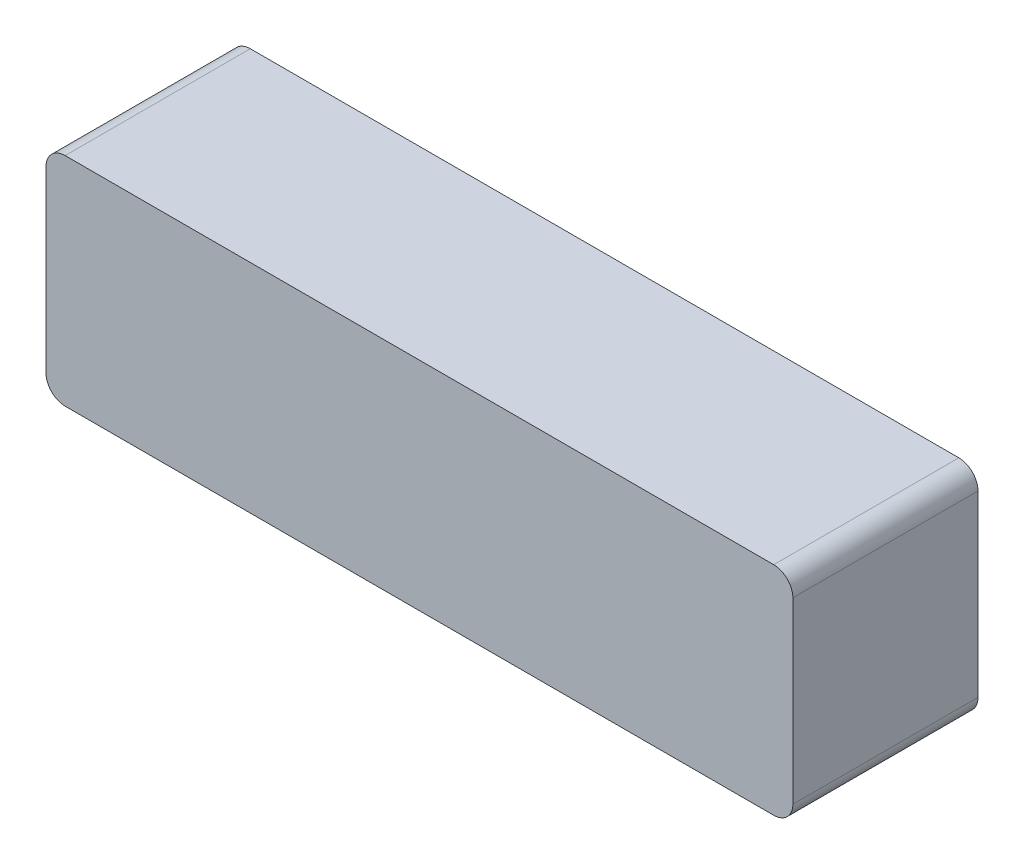
ISO-10303-21;
HEADER;
FILE_DESCRIPTION(('STEP AP214'),'2;1');
FILE_NAME('part.step','',(''),(''),'','','');
FILE_SCHEMA(('AUTOMOTIVE_DESIGN { 1 0 10303 214 1 1 1 1 }'));
ENDSEC;
DATA;
#1=APPLICATION_CONTEXT('core data for automotive mechanical design processes');
#2=APPLICATION_PROTOCOL_DEFINITION('international standard','automotive_design',2000,#1);
#3=PRODUCT_CONTEXT('',#1,'mechanical');
#4=PRODUCT('Part','Part','',(#3));
#5=PRODUCT_RELATED_PRODUCT_CATEGORY('part','',(#4));
#6=PRODUCT_DEFINITION_FORMATION('','',#4);
#7=PRODUCT_DEFINITION_CONTEXT('part definition',#1,'design');
#8=PRODUCT_DEFINITION('design','',#6,#7);
#9=PRODUCT_DEFINITION_SHAPE('','',#8);
#10=(LENGTH_UNIT() NAMED_UNIT(*) SI_UNIT(.MILLI.,.METRE.));
#11=(NAMED_UNIT(*) PLANE_ANGLE_UNIT() SI_UNIT($,.RADIAN.));
#12=(NAMED_UNIT(*) SI_UNIT($,.STERADIAN.) SOLID_ANGLE_UNIT());
#13=UNCERTAINTY_MEASURE_WITH_UNIT(LENGTH_MEASURE(1.E-05),#10,'distance_accuracy_value','');
#14=(GEOMETRIC_REPRESENTATION_CONTEXT(3) GLOBAL_UNCERTAINTY_ASSIGNED_CONTEXT((#13)) GLOBAL_UNIT_ASSIGNED_CONTEXT((#10,
#11,#12)) REPRESENTATION_CONTEXT('',''));
#15=CARTESIAN_POINT('',(0.,0.,0.));
#16=DIRECTION('',(0.,0.,1.));
#17=DIRECTION('',(1.,0.,0.));
#18=AXIS2_PLACEMENT_3D('',#15,#16,#17);
#19=CARTESIAN_POINT('',(55.5,14.,29.));
#20=DIRECTION('',(0.,0.,-1.));
#21=DIRECTION('',(-1.,0.,0.));
#22=AXIS2_PLACEMENT_3D('',#19,#20,#21);
#23=CYLINDRICAL_SURFACE('',#22,3.);
#24=CARTESIAN_POINT('',(55.5,14.,0.));
#25=DIRECTION('',(0.,0.,1.));
#26=DIRECTION('',(-1.,0.,0.));
#27=AXIS2_PLACEMENT_3D('',#24,#25,#26);
#28=CIRCLE('',#27,3.);
#29=CARTESIAN_POINT('',(58.5,14.,0.));
#30=VERTEX_POINT('',#29);
#31=CARTESIAN_POINT('',(55.5,17.,0.));
#32=VERTEX_POINT('',#31);
#33=EDGE_CURVE('E140',#30,#32,#28,.T.);
#34=ORIENTED_EDGE('',*,*,#33,.T.);
#35=DIRECTION('',(0.,0.,-1.));
#36=VECTOR('',#35,1.);
#37=CARTESIAN_POINT('',(55.5,17.,29.));
#38=LINE('',#37,#36);
#39=CARTESIAN_POINT('',(55.5,17.,29.));
#40=VERTEX_POINT('',#39);
#41=EDGE_CURVE('E11',#40,#32,#38,.T.);
#42=ORIENTED_EDGE('',*,*,#41,.F.);
#43=CARTESIAN_POINT('',(55.5,14.,29.));
#44=DIRECTION('',(0.,0.,1.));
#45=DIRECTION('',(-1.,0.,0.));
#46=AXIS2_PLACEMENT_3D('',#43,#44,#45);
#47=CIRCLE('',#46,3.);
#48=CARTESIAN_POINT('',(58.5,14.,29.));
#49=VERTEX_POINT('',#48);
#50=EDGE_CURVE('E162',#49,#40,#47,.T.);
#51=ORIENTED_EDGE('',*,*,#50,.F.);
#52=DIRECTION('',(0.,0.,-1.));
#53=VECTOR('',#52,1.);
#54=CARTESIAN_POINT('',(58.5,14.,29.));
#55=LINE('',#54,#53);
#56=EDGE_CURVE('E136',#49,#30,#55,.T.);
#57=ORIENTED_EDGE('',*,*,#56,.T.);
#58=EDGE_LOOP('',(#34,#42,#51,#57));
#59=FACE_BOUND('',#58,.T.);
#60=ADVANCED_FACE('F39',(#59),#23,.T.);
#61=CARTESIAN_POINT('',(-55.5,17.,29.));
#62=DIRECTION('',(0.,-1.,0.));
#63=DIRECTION('',(0.,0.,-1.));
#64=AXIS2_PLACEMENT_3D('',#61,#62,#63);
#65=PLANE('',#64);
#66=DIRECTION('',(-1.,0.,0.));
#67=VECTOR('',#66,1.);
#68=CARTESIAN_POINT('',(-55.5,17.,0.));
#69=LINE('',#68,#67);
#70=CARTESIAN_POINT('',(-55.5,17.,0.));
#71=VERTEX_POINT('',#70);
#72=EDGE_CURVE('E144',#32,#71,#69,.T.);
#73=ORIENTED_EDGE('',*,*,#72,.T.);
#74=DIRECTION('',(0.,0.,-1.));
#75=VECTOR('',#74,1.);
#76=CARTESIAN_POINT('',(-55.5,17.,29.));
#77=LINE('',#76,#75);
#78=CARTESIAN_POINT('',(-55.5,17.,29.));
#79=VERTEX_POINT('',#78);
#80=EDGE_CURVE('E48',#79,#71,#77,.T.);
#81=ORIENTED_EDGE('',*,*,#80,.F.);
#82=DIRECTION('',(-1.,0.,0.));
#83=VECTOR('',#82,1.);
#84=CARTESIAN_POINT('',(-55.5,17.,29.));
#85=LINE('',#84,#83);
#86=EDGE_CURVE('E99',#40,#79,#85,.T.);
#87=ORIENTED_EDGE('',*,*,#86,.F.);
#88=ORIENTED_EDGE('',*,*,#41,.T.);
#89=EDGE_LOOP('',(#73,#81,#87,#88));
#90=FACE_BOUND('',#89,.T.);
#91=ADVANCED_FACE('F208',(#90),#65,.F.);
#92=CARTESIAN_POINT('',(-55.5,14.,29.));
#93=DIRECTION('',(0.,0.,-1.));
#94=DIRECTION('',(-1.,0.,0.));
#95=AXIS2_PLACEMENT_3D('',#92,#93,#94);
#96=CYLINDRICAL_SURFACE('',#95,3.);
#97=CARTESIAN_POINT('',(-55.5,14.,0.));
#98=DIRECTION('',(0.,0.,1.));
#99=DIRECTION('',(-1.,0.,0.));
#100=AXIS2_PLACEMENT_3D('',#97,#98,#99);
#101=CIRCLE('',#100,3.);
#102=CARTESIAN_POINT('',(-58.5,14.,0.));
#103=VERTEX_POINT('',#102);
#104=EDGE_CURVE('E147',#71,#103,#101,.T.);
#105=ORIENTED_EDGE('',*,*,#104,.T.);
#106=DIRECTION('',(0.,0.,-1.));
#107=VECTOR('',#106,1.);
#108=CARTESIAN_POINT('',(-58.5,14.,29.));
#109=LINE('',#108,#107);
#110=CARTESIAN_POINT('',(-58.5,14.,29.));
#111=VERTEX_POINT('',#110);
#112=EDGE_CURVE('E173',#111,#103,#109,.T.);
#113=ORIENTED_EDGE('',*,*,#112,.F.);
#114=CARTESIAN_POINT('',(-55.5,14.,29.));
#115=DIRECTION('',(0.,0.,1.));
#116=DIRECTION('',(-1.,0.,0.));
#117=AXIS2_PLACEMENT_3D('',#114,#115,#116);
#118=CIRCLE('',#117,3.);
#119=EDGE_CURVE('E183',#79,#111,#118,.T.);
#120=ORIENTED_EDGE('',*,*,#119,.F.);
#121=ORIENTED_EDGE('',*,*,#80,.T.);
#122=EDGE_LOOP('',(#105,#113,#120,#121));
#123=FACE_BOUND('',#122,.T.);
#124=ADVANCED_FACE('F181',(#123),#96,.T.);
#125=CARTESIAN_POINT('',(-58.5,-14.,29.));
#126=DIRECTION('',(1.,0.,0.));
#127=DIRECTION('',(0.,0.,-1.));
#128=AXIS2_PLACEMENT_3D('',#125,#126,#127);
#129=PLANE('',#128);
#130=DIRECTION('',(0.,-1.,0.));
#131=VECTOR('',#130,1.);
#132=CARTESIAN_POINT('',(-58.5,-14.,0.));
#133=LINE('',#132,#131);
#134=CARTESIAN_POINT('',(-58.5,-14.,0.));
#135=VERTEX_POINT('',#134);
#136=EDGE_CURVE('E150',#103,#135,#133,.T.);
#137=ORIENTED_EDGE('',*,*,#136,.T.);
#138=DIRECTION('',(0.,0.,-1.));
#139=VECTOR('',#138,1.);
#140=CARTESIAN_POINT('',(-58.5,-14.,29.));
#141=LINE('',#140,#139);
#142=CARTESIAN_POINT('',(-58.5,-14.,29.));
#143=VERTEX_POINT('',#142);
#144=EDGE_CURVE('E169',#143,#135,#141,.T.);
#145=ORIENTED_EDGE('',*,*,#144,.F.);
#146=DIRECTION('',(0.,-1.,0.));
#147=VECTOR('',#146,1.);
#148=CARTESIAN_POINT('',(-58.5,-14.,29.));
#149=LINE('',#148,#147);
#150=EDGE_CURVE('E196',#111,#143,#149,.T.);
#151=ORIENTED_EDGE('',*,*,#150,.F.);
#152=ORIENTED_EDGE('',*,*,#112,.T.);
#153=EDGE_LOOP('',(#137,#145,#151,#152));
#154=FACE_BOUND('',#153,.T.);
#155=ADVANCED_FACE('F191',(#154),#129,.F.);
#156=CARTESIAN_POINT('',(-55.5,-14.,29.));
#157=DIRECTION('',(0.,0.,-1.));
#158=DIRECTION('',(-1.,0.,0.));
#159=AXIS2_PLACEMENT_3D('',#156,#157,#158);
#160=CYLINDRICAL_SURFACE('',#159,3.);
#161=CARTESIAN_POINT('',(-55.5,-14.,0.));
#162=DIRECTION('',(0.,0.,1.));
#163=DIRECTION('',(-1.,0.,0.));
#164=AXIS2_PLACEMENT_3D('',#161,#162,#163);
#165=CIRCLE('',#164,3.);
#166=CARTESIAN_POINT('',(-55.5,-17.,0.));
#167=VERTEX_POINT('',#166);
#168=EDGE_CURVE('E153',#135,#167,#165,.T.);
#169=ORIENTED_EDGE('',*,*,#168,.T.);
#170=DIRECTION('',(0.,0.,-1.));
#171=VECTOR('',#170,1.);
#172=CARTESIAN_POINT('',(-55.5,-17.,29.));
#173=LINE('',#172,#171);
#174=CARTESIAN_POINT('',(-55.5,-17.,29.));
#175=VERTEX_POINT('',#174);
#176=EDGE_CURVE('E129',#175,#167,#173,.T.);
#177=ORIENTED_EDGE('',*,*,#176,.F.);
#178=CARTESIAN_POINT('',(-55.5,-14.,29.));
#179=DIRECTION('',(0.,0.,1.));
#180=DIRECTION('',(-1.,0.,0.));
#181=AXIS2_PLACEMENT_3D('',#178,#179,#180);
#182=CIRCLE('',#181,3.);
#183=EDGE_CURVE('E118',#143,#175,#182,.T.);
#184=ORIENTED_EDGE('',*,*,#183,.F.);
#185=ORIENTED_EDGE('',*,*,#144,.T.);
#186=EDGE_LOOP('',(#169,#177,#184,#185));
#187=FACE_BOUND('',#186,.T.);
#188=ADVANCED_FACE('F194',(#187),#160,.T.);
#189=CARTESIAN_POINT('',(-55.5,-17.,29.));
#190=DIRECTION('',(0.,1.,0.));
#191=DIRECTION('',(0.,0.,1.));
#192=AXIS2_PLACEMENT_3D('',#189,#190,#191);
#193=PLANE('',#192);
#194=DIRECTION('',(1.,0.,0.));
#195=VECTOR('',#194,1.);
#196=CARTESIAN_POINT('',(-55.5,-17.,0.));
#197=LINE('',#196,#195);
#198=CARTESIAN_POINT('',(55.5,-17.,0.));
#199=VERTEX_POINT('',#198);
#200=EDGE_CURVE('E127',#167,#199,#197,.T.);
#201=ORIENTED_EDGE('',*,*,#200,.T.);
#202=DIRECTION('',(0.,0.,-1.));
#203=VECTOR('',#202,1.);
#204=CARTESIAN_POINT('',(55.5,-17.,29.));
#205=LINE('',#204,#203);
#206=CARTESIAN_POINT('',(55.5,-17.,29.));
#207=VERTEX_POINT('',#206);
#208=EDGE_CURVE('E124',#207,#199,#205,.T.);
#209=ORIENTED_EDGE('',*,*,#208,.F.);
#210=DIRECTION('',(1.,0.,0.));
#211=VECTOR('',#210,1.);
#212=CARTESIAN_POINT('',(-55.5,-17.,29.));
#213=LINE('',#212,#211);
#214=EDGE_CURVE('E112',#175,#207,#213,.T.);
#215=ORIENTED_EDGE('',*,*,#214,.F.);
#216=ORIENTED_EDGE('',*,*,#176,.T.);
#217=EDGE_LOOP('',(#201,#209,#215,#216));
#218=FACE_BOUND('',#217,.T.);
#219=ADVANCED_FACE('F125',(#218),#193,.F.);
#220=CARTESIAN_POINT('',(55.5,-14.,29.));
#221=DIRECTION('',(0.,0.,-1.));
#222=DIRECTION('',(-1.,0.,0.));
#223=AXIS2_PLACEMENT_3D('',#220,#221,#222);
#224=CYLINDRICAL_SURFACE('',#223,3.);
#225=CARTESIAN_POINT('',(55.5,-14.,0.));
#226=DIRECTION('',(0.,0.,1.));
#227=DIRECTION('',(-1.,0.,0.));
#228=AXIS2_PLACEMENT_3D('',#225,#226,#227);
#229=CIRCLE('',#228,3.);
#230=CARTESIAN_POINT('',(58.5,-14.,0.));
#231=VERTEX_POINT('',#230);
#232=EDGE_CURVE('E85',#199,#231,#229,.T.);
#233=ORIENTED_EDGE('',*,*,#232,.T.);
#234=DIRECTION('',(0.,0.,-1.));
#235=VECTOR('',#234,1.);
#236=CARTESIAN_POINT('',(58.5,-14.,29.));
#237=LINE('',#236,#235);
#238=CARTESIAN_POINT('',(58.5,-14.,29.));
#239=VERTEX_POINT('',#238);
#240=EDGE_CURVE('E130',#239,#231,#237,.T.);
#241=ORIENTED_EDGE('',*,*,#240,.F.);
#242=CARTESIAN_POINT('',(55.5,-14.,29.));
#243=DIRECTION('',(0.,0.,1.));
#244=DIRECTION('',(-1.,0.,0.));
#245=AXIS2_PLACEMENT_3D('',#242,#243,#244);
#246=CIRCLE('',#245,3.);
#247=EDGE_CURVE('E116',#207,#239,#246,.T.);
#248=ORIENTED_EDGE('',*,*,#247,.F.);
#249=ORIENTED_EDGE('',*,*,#208,.T.);
#250=EDGE_LOOP('',(#233,#241,#248,#249));
#251=FACE_BOUND('',#250,.T.);
#252=ADVANCED_FACE('F132',(#251),#224,.T.);
#253=CARTESIAN_POINT('',(58.5,-14.,29.));
#254=DIRECTION('',(-1.,0.,0.));
#255=DIRECTION('',(0.,0.,1.));
#256=AXIS2_PLACEMENT_3D('',#253,#254,#255);
#257=PLANE('',#256);
#258=DIRECTION('',(0.,1.,0.));
#259=VECTOR('',#258,1.);
#260=CARTESIAN_POINT('',(58.5,-14.,0.));
#261=LINE('',#260,#259);
#262=EDGE_CURVE('E91',#231,#30,#261,.T.);
#263=ORIENTED_EDGE('',*,*,#262,.T.);
#264=ORIENTED_EDGE('',*,*,#56,.F.);
#265=DIRECTION('',(0.,1.,0.));
#266=VECTOR('',#265,1.);
#267=CARTESIAN_POINT('',(58.5,-14.,29.));
#268=LINE('',#267,#266);
#269=EDGE_CURVE('E56',#239,#49,#268,.T.);
#270=ORIENTED_EDGE('',*,*,#269,.F.);
#271=ORIENTED_EDGE('',*,*,#240,.T.);
#272=EDGE_LOOP('',(#263,#264,#270,#271));
#273=FACE_BOUND('',#272,.T.);
#274=ADVANCED_FACE('F224',(#273),#257,.F.);
#275=CARTESIAN_POINT('',(55.5,14.,29.));
#276=DIRECTION('',(0.,0.,-1.));
#277=DIRECTION('',(-1.,0.,0.));
#278=AXIS2_PLACEMENT_3D('',#275,#276,#277);
#279=PLANE('',#278);
#280=ORIENTED_EDGE('',*,*,#50,.T.);
#281=ORIENTED_EDGE('',*,*,#86,.T.);
#282=ORIENTED_EDGE('',*,*,#119,.T.);
#283=ORIENTED_EDGE('',*,*,#150,.T.);
#284=ORIENTED_EDGE('',*,*,#183,.T.);
#285=ORIENTED_EDGE('',*,*,#214,.T.);
#286=ORIENTED_EDGE('',*,*,#247,.T.);
#287=ORIENTED_EDGE('',*,*,#269,.T.);
#288=EDGE_LOOP('',(#280,#281,#282,#283,#284,#285,#286,#287));
#289=FACE_BOUND('',#288,.T.);
#290=ADVANCED_FACE('F114',(#289),#279,.F.);
#291=CARTESIAN_POINT('',(55.5,14.,0.));
#292=DIRECTION('',(0.,0.,-1.));
#293=DIRECTION('',(-1.,0.,0.));
#294=AXIS2_PLACEMENT_3D('',#291,#292,#293);
#295=PLANE('',#294);
#296=ORIENTED_EDGE('',*,*,#33,.F.);
#297=ORIENTED_EDGE('',*,*,#262,.F.);
#298=ORIENTED_EDGE('',*,*,#232,.F.);
#299=ORIENTED_EDGE('',*,*,#200,.F.);
#300=ORIENTED_EDGE('',*,*,#168,.F.);
#301=ORIENTED_EDGE('',*,*,#136,.F.);
#302=ORIENTED_EDGE('',*,*,#104,.F.);
#303=ORIENTED_EDGE('',*,*,#72,.F.);
#304=EDGE_LOOP('',(#296,#297,#298,#299,#300,#301,#302,#303));
#305=FACE_BOUND('',#304,.T.);
#306=ADVANCED_FACE('F187',(#305),#295,.T.);
#307=CLOSED_SHELL('',(#60,#91,#124,#155,#188,#219,#252,#274,#290,#306));
#308=MANIFOLD_SOLID_BREP('B2',#307);
#309=ADVANCED_BREP_SHAPE_REPRESENTATION('',(#18,#308),#14);
#310=SHAPE_DEFINITION_REPRESENTATION(#9,#309);
ENDSEC;
END-ISO-10303-21;
